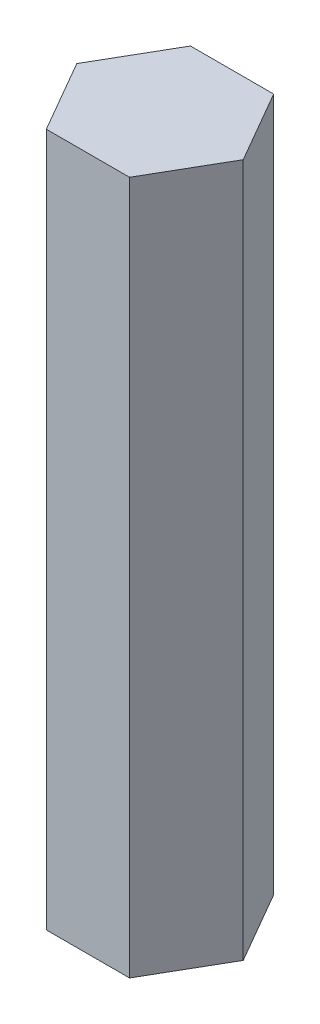
ISO-10303-21;
HEADER;
FILE_DESCRIPTION(('STEP AP214'),'2;1');
FILE_NAME('part.step','',(''),(''),'','','');
FILE_SCHEMA(('AUTOMOTIVE_DESIGN { 1 0 10303 214 1 1 1 1 }'));
ENDSEC;
DATA;
#1=APPLICATION_CONTEXT('core data for automotive mechanical design processes');
#2=APPLICATION_PROTOCOL_DEFINITION('international standard','automotive_design',2000,#1);
#3=PRODUCT_CONTEXT('',#1,'mechanical');
#4=PRODUCT('Part','Part','',(#3));
#5=PRODUCT_RELATED_PRODUCT_CATEGORY('part','',(#4));
#6=PRODUCT_DEFINITION_FORMATION('','',#4);
#7=PRODUCT_DEFINITION_CONTEXT('part definition',#1,'design');
#8=PRODUCT_DEFINITION('design','',#6,#7);
#9=PRODUCT_DEFINITION_SHAPE('','',#8);
#10=(LENGTH_UNIT() NAMED_UNIT(*) SI_UNIT(.MILLI.,.METRE.));
#11=(NAMED_UNIT(*) PLANE_ANGLE_UNIT() SI_UNIT($,.RADIAN.));
#12=(NAMED_UNIT(*) SI_UNIT($,.STERADIAN.) SOLID_ANGLE_UNIT());
#13=UNCERTAINTY_MEASURE_WITH_UNIT(LENGTH_MEASURE(1.E-05),#10,'distance_accuracy_value','');
#14=(GEOMETRIC_REPRESENTATION_CONTEXT(3) GLOBAL_UNCERTAINTY_ASSIGNED_CONTEXT((#13)) GLOBAL_UNIT_ASSIGNED_CONTEXT((#10,
#11,#12)) REPRESENTATION_CONTEXT('',''));
#15=CARTESIAN_POINT('',(0.,0.,0.));
#16=DIRECTION('',(0.,0.,1.));
#17=DIRECTION('',(1.,0.,0.));
#18=AXIS2_PLACEMENT_3D('',#15,#16,#17);
#19=CARTESIAN_POINT('',(1.5,25.,2.59807621135332));
#20=DIRECTION('',(-0.866025403784439,0.,-0.5));
#21=DIRECTION('',(-0.5,0.,0.866025403784439));
#22=AXIS2_PLACEMENT_3D('',#19,#20,#21);
#23=PLANE('',#22);
#24=DIRECTION('',(0.5,0.,-0.866025403784439));
#25=VECTOR('',#24,1.);
#26=CARTESIAN_POINT('',(1.5,0.,2.59807621135332));
#27=LINE('',#26,#25);
#28=CARTESIAN_POINT('',(1.5,0.,2.59807621135332));
#29=VERTEX_POINT('',#28);
#30=CARTESIAN_POINT('',(3.,0.,0.));
#31=VERTEX_POINT('',#30);
#32=EDGE_CURVE('E116',#29,#31,#27,.T.);
#33=ORIENTED_EDGE('',*,*,#32,.T.);
#34=DIRECTION('',(0.,-1.,0.));
#35=VECTOR('',#34,1.);
#36=CARTESIAN_POINT('',(3.,25.,0.));
#37=LINE('',#36,#35);
#38=CARTESIAN_POINT('',(3.,25.,0.));
#39=VERTEX_POINT('',#38);
#40=EDGE_CURVE('E11',#39,#31,#37,.T.);
#41=ORIENTED_EDGE('',*,*,#40,.F.);
#42=DIRECTION('',(0.5,0.,-0.866025403784439));
#43=VECTOR('',#42,1.);
#44=CARTESIAN_POINT('',(1.5,25.,2.59807621135332));
#45=LINE('',#44,#43);
#46=CARTESIAN_POINT('',(1.5,25.,2.59807621135332));
#47=VERTEX_POINT('',#46);
#48=EDGE_CURVE('E127',#47,#39,#45,.T.);
#49=ORIENTED_EDGE('',*,*,#48,.F.);
#50=DIRECTION('',(0.,-1.,0.));
#51=VECTOR('',#50,1.);
#52=CARTESIAN_POINT('',(1.5,25.,2.59807621135332));
#53=LINE('',#52,#51);
#54=EDGE_CURVE('E112',#47,#29,#53,.T.);
#55=ORIENTED_EDGE('',*,*,#54,.T.);
#56=EDGE_LOOP('',(#33,#41,#49,#55));
#57=FACE_BOUND('',#56,.T.);
#58=ADVANCED_FACE('F32',(#57),#23,.F.);
#59=CARTESIAN_POINT('',(3.,25.,0.));
#60=DIRECTION('',(-0.866025403784439,0.,0.5));
#61=DIRECTION('',(0.5,0.,0.866025403784439));
#62=AXIS2_PLACEMENT_3D('',#59,#60,#61);
#63=PLANE('',#62);
#64=DIRECTION('',(-0.5,0.,-0.866025403784439));
#65=VECTOR('',#64,1.);
#66=CARTESIAN_POINT('',(3.,0.,0.));
#67=LINE('',#66,#65);
#68=CARTESIAN_POINT('',(1.5,0.,-2.59807621135332));
#69=VERTEX_POINT('',#68);
#70=EDGE_CURVE('E119',#31,#69,#67,.T.);
#71=ORIENTED_EDGE('',*,*,#70,.T.);
#72=DIRECTION('',(0.,-1.,0.));
#73=VECTOR('',#72,1.);
#74=CARTESIAN_POINT('',(1.5,25.,-2.59807621135332));
#75=LINE('',#74,#73);
#76=CARTESIAN_POINT('',(1.5,25.,-2.59807621135332));
#77=VERTEX_POINT('',#76);
#78=EDGE_CURVE('E40',#77,#69,#75,.T.);
#79=ORIENTED_EDGE('',*,*,#78,.F.);
#80=DIRECTION('',(-0.5,0.,-0.866025403784439));
#81=VECTOR('',#80,1.);
#82=CARTESIAN_POINT('',(3.,25.,0.));
#83=LINE('',#82,#81);
#84=EDGE_CURVE('E85',#39,#77,#83,.T.);
#85=ORIENTED_EDGE('',*,*,#84,.F.);
#86=ORIENTED_EDGE('',*,*,#40,.T.);
#87=EDGE_LOOP('',(#71,#79,#85,#86));
#88=FACE_BOUND('',#87,.T.);
#89=ADVANCED_FACE('F151',(#88),#63,.F.);
#90=CARTESIAN_POINT('',(1.5,25.,-2.59807621135332));
#91=DIRECTION('',(0.,0.,1.));
#92=DIRECTION('',(1.,0.,0.));
#93=AXIS2_PLACEMENT_3D('',#90,#91,#92);
#94=PLANE('',#93);
#95=DIRECTION('',(-1.,0.,0.));
#96=VECTOR('',#95,1.);
#97=CARTESIAN_POINT('',(1.5,0.,-2.59807621135332));
#98=LINE('',#97,#96);
#99=CARTESIAN_POINT('',(-1.5,0.,-2.59807621135332));
#100=VERTEX_POINT('',#99);
#101=EDGE_CURVE('E122',#69,#100,#98,.T.);
#102=ORIENTED_EDGE('',*,*,#101,.T.);
#103=DIRECTION('',(0.,-1.,0.));
#104=VECTOR('',#103,1.);
#105=CARTESIAN_POINT('',(-1.5,25.,-2.59807621135332));
#106=LINE('',#105,#104);
#107=CARTESIAN_POINT('',(-1.5,25.,-2.59807621135332));
#108=VERTEX_POINT('',#107);
#109=EDGE_CURVE('E107',#108,#100,#106,.T.);
#110=ORIENTED_EDGE('',*,*,#109,.F.);
#111=DIRECTION('',(-1.,0.,0.));
#112=VECTOR('',#111,1.);
#113=CARTESIAN_POINT('',(1.5,25.,-2.59807621135332));
#114=LINE('',#113,#112);
#115=EDGE_CURVE('E98',#77,#108,#114,.T.);
#116=ORIENTED_EDGE('',*,*,#115,.F.);
#117=ORIENTED_EDGE('',*,*,#78,.T.);
#118=EDGE_LOOP('',(#102,#110,#116,#117));
#119=FACE_BOUND('',#118,.T.);
#120=ADVANCED_FACE('F133',(#119),#94,.F.);
#121=CARTESIAN_POINT('',(-1.5,25.,-2.59807621135332));
#122=DIRECTION('',(0.866025403784439,0.,0.5));
#123=DIRECTION('',(0.5,0.,-0.866025403784439));
#124=AXIS2_PLACEMENT_3D('',#121,#122,#123);
#125=PLANE('',#124);
#126=DIRECTION('',(-0.5,0.,0.866025403784439));
#127=VECTOR('',#126,1.);
#128=CARTESIAN_POINT('',(-1.5,0.,-2.59807621135332));
#129=LINE('',#128,#127);
#130=CARTESIAN_POINT('',(-3.,0.,0.));
#131=VERTEX_POINT('',#130);
#132=EDGE_CURVE('E106',#100,#131,#129,.T.);
#133=ORIENTED_EDGE('',*,*,#132,.T.);
#134=DIRECTION('',(0.,-1.,0.));
#135=VECTOR('',#134,1.);
#136=CARTESIAN_POINT('',(-3.,25.,0.));
#137=LINE('',#136,#135);
#138=CARTESIAN_POINT('',(-3.,25.,0.));
#139=VERTEX_POINT('',#138);
#140=EDGE_CURVE('E103',#139,#131,#137,.T.);
#141=ORIENTED_EDGE('',*,*,#140,.F.);
#142=DIRECTION('',(-0.5,0.,0.866025403784439));
#143=VECTOR('',#142,1.);
#144=CARTESIAN_POINT('',(-1.5,25.,-2.59807621135332));
#145=LINE('',#144,#143);
#146=EDGE_CURVE('E92',#108,#139,#145,.T.);
#147=ORIENTED_EDGE('',*,*,#146,.F.);
#148=ORIENTED_EDGE('',*,*,#109,.T.);
#149=EDGE_LOOP('',(#133,#141,#147,#148));
#150=FACE_BOUND('',#149,.T.);
#151=ADVANCED_FACE('F104',(#150),#125,.F.);
#152=CARTESIAN_POINT('',(-3.,25.,0.));
#153=DIRECTION('',(0.866025403784439,0.,-0.5));
#154=DIRECTION('',(-0.5,0.,-0.866025403784439));
#155=AXIS2_PLACEMENT_3D('',#152,#153,#154);
#156=PLANE('',#155);
#157=DIRECTION('',(0.5,0.,0.866025403784439));
#158=VECTOR('',#157,1.);
#159=CARTESIAN_POINT('',(-3.,0.,0.));
#160=LINE('',#159,#158);
#161=CARTESIAN_POINT('',(-1.5,0.,2.59807621135332));
#162=VERTEX_POINT('',#161);
#163=EDGE_CURVE('E71',#131,#162,#160,.T.);
#164=ORIENTED_EDGE('',*,*,#163,.T.);
#165=DIRECTION('',(0.,-1.,0.));
#166=VECTOR('',#165,1.);
#167=CARTESIAN_POINT('',(-1.5,25.,2.59807621135332));
#168=LINE('',#167,#166);
#169=CARTESIAN_POINT('',(-1.5,25.,2.59807621135332));
#170=VERTEX_POINT('',#169);
#171=EDGE_CURVE('E108',#170,#162,#168,.T.);
#172=ORIENTED_EDGE('',*,*,#171,.F.);
#173=DIRECTION('',(0.5,0.,0.866025403784439));
#174=VECTOR('',#173,1.);
#175=CARTESIAN_POINT('',(-3.,25.,0.));
#176=LINE('',#175,#174);
#177=EDGE_CURVE('E96',#139,#170,#176,.T.);
#178=ORIENTED_EDGE('',*,*,#177,.F.);
#179=ORIENTED_EDGE('',*,*,#140,.T.);
#180=EDGE_LOOP('',(#164,#172,#178,#179));
#181=FACE_BOUND('',#180,.T.);
#182=ADVANCED_FACE('F110',(#181),#156,.F.);
#183=CARTESIAN_POINT('',(-1.5,25.,2.59807621135332));
#184=DIRECTION('',(0.,0.,-1.));
#185=DIRECTION('',(-1.,0.,0.));
#186=AXIS2_PLACEMENT_3D('',#183,#184,#185);
#187=PLANE('',#186);
#188=DIRECTION('',(1.,0.,0.));
#189=VECTOR('',#188,1.);
#190=CARTESIAN_POINT('',(-1.5,0.,2.59807621135332));
#191=LINE('',#190,#189);
#192=EDGE_CURVE('E77',#162,#29,#191,.T.);
#193=ORIENTED_EDGE('',*,*,#192,.T.);
#194=ORIENTED_EDGE('',*,*,#54,.F.);
#195=DIRECTION('',(1.,0.,0.));
#196=VECTOR('',#195,1.);
#197=CARTESIAN_POINT('',(-1.5,25.,2.59807621135332));
#198=LINE('',#197,#196);
#199=EDGE_CURVE('E48',#170,#47,#198,.T.);
#200=ORIENTED_EDGE('',*,*,#199,.F.);
#201=ORIENTED_EDGE('',*,*,#171,.T.);
#202=EDGE_LOOP('',(#193,#194,#200,#201));
#203=FACE_BOUND('',#202,.T.);
#204=ADVANCED_FACE('F140',(#203),#187,.F.);
#205=CARTESIAN_POINT('',(0.,25.,0.));
#206=DIRECTION('',(0.,1.,0.));
#207=DIRECTION('',(0.,0.,1.));
#208=AXIS2_PLACEMENT_3D('',#205,#206,#207);
#209=PLANE('',#208);
#210=ORIENTED_EDGE('',*,*,#48,.T.);
#211=ORIENTED_EDGE('',*,*,#84,.T.);
#212=ORIENTED_EDGE('',*,*,#115,.T.);
#213=ORIENTED_EDGE('',*,*,#146,.T.);
#214=ORIENTED_EDGE('',*,*,#177,.T.);
#215=ORIENTED_EDGE('',*,*,#199,.T.);
#216=EDGE_LOOP('',(#210,#211,#212,#213,#214,#215));
#217=FACE_BOUND('',#216,.T.);
#218=ADVANCED_FACE('F94',(#217),#209,.T.);
#219=CARTESIAN_POINT('',(0.,0.,0.));
#220=DIRECTION('',(0.,1.,0.));
#221=DIRECTION('',(0.,0.,1.));
#222=AXIS2_PLACEMENT_3D('',#219,#220,#221);
#223=PLANE('',#222);
#224=CARTESIAN_POINT('',(0.,0.,0.));
#225=DIRECTION('',(0.,-1.,0.));
#226=DIRECTION('',(0.,0.,-1.));
#227=AXIS2_PLACEMENT_3D('',#224,#225,#226);
#228=CIRCLE('',#227,1.6);
#229=CARTESIAN_POINT('',(0.,0.,-1.6));
#230=VERTEX_POINT('',#229);
#231=EDGE_CURVE('E213',#230,#230,#228,.T.);
#232=ORIENTED_EDGE('',*,*,#231,.F.);
#233=EDGE_LOOP('',(#232));
#234=FACE_BOUND('',#233,.T.);
#235=ORIENTED_EDGE('',*,*,#32,.F.);
#236=ORIENTED_EDGE('',*,*,#192,.F.);
#237=ORIENTED_EDGE('',*,*,#163,.F.);
#238=ORIENTED_EDGE('',*,*,#132,.F.);
#239=ORIENTED_EDGE('',*,*,#101,.F.);
#240=ORIENTED_EDGE('',*,*,#70,.F.);
#241=EDGE_LOOP('',(#235,#236,#237,#238,#239,#240));
#242=FACE_BOUND('',#241,.T.);
#243=ADVANCED_FACE('F136',(#234,#242),#223,.F.);
#244=CARTESIAN_POINT('',(0.,5.,0.));
#245=DIRECTION('',(0.,-1.,0.));
#246=DIRECTION('',(0.,0.,-1.));
#247=AXIS2_PLACEMENT_3D('',#244,#245,#246);
#248=CYLINDRICAL_SURFACE('',#247,1.6);
#249=CARTESIAN_POINT('',(0.,5.,0.));
#250=DIRECTION('',(0.,-1.,0.));
#251=DIRECTION('',(0.,0.,-1.));
#252=AXIS2_PLACEMENT_3D('',#249,#250,#251);
#253=CIRCLE('',#252,1.6);
#254=CARTESIAN_POINT('',(0.,5.,-1.6));
#255=VERTEX_POINT('',#254);
#256=EDGE_CURVE('E120',#255,#255,#253,.T.);
#257=ORIENTED_EDGE('',*,*,#256,.F.);
#258=EDGE_LOOP('',(#257));
#259=FACE_BOUND('',#258,.T.);
#260=ORIENTED_EDGE('',*,*,#231,.T.);
#261=EDGE_LOOP('',(#260));
#262=FACE_BOUND('',#261,.T.);
#263=ADVANCED_FACE('F188',(#259,#262),#248,.F.);
#264=CARTESIAN_POINT('',(0.,5.,0.));
#265=DIRECTION('',(0.,-1.,0.));
#266=DIRECTION('',(0.,0.,-1.));
#267=AXIS2_PLACEMENT_3D('',#264,#265,#266);
#268=PLANE('',#267);
#269=ORIENTED_EDGE('',*,*,#256,.T.);
#270=EDGE_LOOP('',(#269));
#271=FACE_BOUND('',#270,.T.);
#272=ADVANCED_FACE('F197',(#271),#268,.T.);
#273=CLOSED_SHELL('',(#58,#89,#120,#151,#182,#204,#218,#243,#263,#272));
#274=MANIFOLD_SOLID_BREP('B2',#273);
#275=ADVANCED_BREP_SHAPE_REPRESENTATION('',(#18,#274),#14);
#276=SHAPE_DEFINITION_REPRESENTATION(#9,#275);
ENDSEC;
END-ISO-10303-21;
